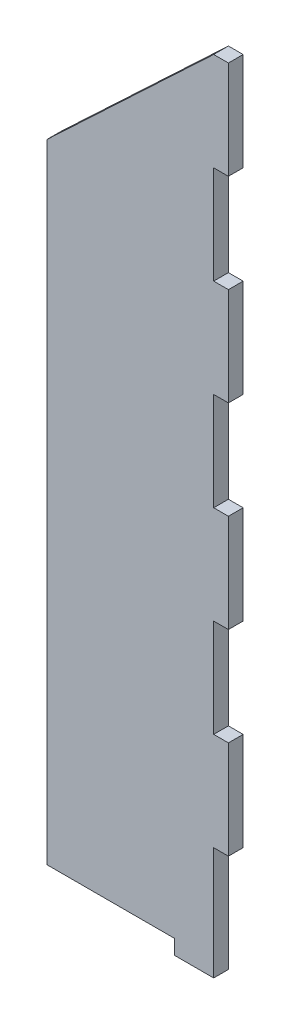
ISO-10303-21;
HEADER;
FILE_DESCRIPTION(('STEP AP214'),'2;1');
FILE_NAME('part.step','',(''),(''),'','','');
FILE_SCHEMA(('AUTOMOTIVE_DESIGN { 1 0 10303 214 1 1 1 1 }'));
ENDSEC;
DATA;
#1=APPLICATION_CONTEXT('core data for automotive mechanical design processes');
#2=APPLICATION_PROTOCOL_DEFINITION('international standard','automotive_design',2000,#1);
#3=PRODUCT_CONTEXT('',#1,'mechanical');
#4=PRODUCT('Part','Part','',(#3));
#5=PRODUCT_RELATED_PRODUCT_CATEGORY('part','',(#4));
#6=PRODUCT_DEFINITION_FORMATION('','',#4);
#7=PRODUCT_DEFINITION_CONTEXT('part definition',#1,'design');
#8=PRODUCT_DEFINITION('design','',#6,#7);
#9=PRODUCT_DEFINITION_SHAPE('','',#8);
#10=(LENGTH_UNIT() NAMED_UNIT(*) SI_UNIT(.MILLI.,.METRE.));
#11=(NAMED_UNIT(*) PLANE_ANGLE_UNIT() SI_UNIT($,.RADIAN.));
#12=(NAMED_UNIT(*) SI_UNIT($,.STERADIAN.) SOLID_ANGLE_UNIT());
#13=UNCERTAINTY_MEASURE_WITH_UNIT(LENGTH_MEASURE(1.E-05),#10,'distance_accuracy_value','');
#14=(GEOMETRIC_REPRESENTATION_CONTEXT(3) GLOBAL_UNCERTAINTY_ASSIGNED_CONTEXT((#13)) GLOBAL_UNIT_ASSIGNED_CONTEXT((#10,
#11,#12)) REPRESENTATION_CONTEXT('',''));
#15=CARTESIAN_POINT('',(0.,0.,0.));
#16=DIRECTION('',(0.,0.,1.));
#17=DIRECTION('',(1.,0.,0.));
#18=AXIS2_PLACEMENT_3D('',#15,#16,#17);
#19=CARTESIAN_POINT('',(0.,25.3999999999999,4.7625));
#20=DIRECTION('',(0.,1.,0.));
#21=DIRECTION('',(-1.,0.,0.));
#22=AXIS2_PLACEMENT_3D('',#19,#20,#21);
#23=PLANE('',#22);
#24=DIRECTION('',(1.,0.,0.));
#25=VECTOR('',#24,1.);
#26=CARTESIAN_POINT('',(0.,25.3999999999999,0.));
#27=LINE('',#26,#25);
#28=CARTESIAN_POINT('',(26.9875,25.4,0.));
#29=VERTEX_POINT('',#28);
#30=CARTESIAN_POINT('',(31.750000000001,25.4,0.));
#31=VERTEX_POINT('',#30);
#32=EDGE_CURVE('E309',#29,#31,#27,.T.);
#33=ORIENTED_EDGE('',*,*,#32,.F.);
#34=DIRECTION('',(0.,0.,-1.));
#35=VECTOR('',#34,1.);
#36=CARTESIAN_POINT('',(26.9875,25.4,4.7625));
#37=LINE('',#36,#35);
#38=CARTESIAN_POINT('',(26.9875,25.4,4.7625));
#39=VERTEX_POINT('',#38);
#40=EDGE_CURVE('E11',#39,#29,#37,.T.);
#41=ORIENTED_EDGE('',*,*,#40,.F.);
#42=DIRECTION('',(1.,0.,0.));
#43=VECTOR('',#42,1.);
#44=CARTESIAN_POINT('',(0.,25.3999999999999,4.7625));
#45=LINE('',#44,#43);
#46=CARTESIAN_POINT('',(31.750000000001,25.4,4.7625));
#47=VERTEX_POINT('',#46);
#48=EDGE_CURVE('E248',#39,#47,#45,.T.);
#49=ORIENTED_EDGE('',*,*,#48,.T.);
#50=DIRECTION('',(0.,0.,-1.));
#51=VECTOR('',#50,1.);
#52=CARTESIAN_POINT('',(31.750000000001,25.4,4.7625));
#53=LINE('',#52,#51);
#54=EDGE_CURVE('E52',#47,#31,#53,.T.);
#55=ORIENTED_EDGE('',*,*,#54,.T.);
#56=EDGE_LOOP('',(#33,#41,#49,#55));
#57=FACE_BOUND('',#56,.T.);
#58=ADVANCED_FACE('F36',(#57),#23,.T.);
#59=CARTESIAN_POINT('',(26.9875,0.,4.7625));
#60=DIRECTION('',(1.,0.,0.));
#61=DIRECTION('',(0.,1.,0.));
#62=AXIS2_PLACEMENT_3D('',#59,#60,#61);
#63=PLANE('',#62);
#64=DIRECTION('',(0.,-1.,0.));
#65=VECTOR('',#64,1.);
#66=CARTESIAN_POINT('',(26.9875,0.,0.));
#67=LINE('',#66,#65);
#68=CARTESIAN_POINT('',(26.9875,57.15,0.));
#69=VERTEX_POINT('',#68);
#70=EDGE_CURVE('E303',#69,#29,#67,.T.);
#71=ORIENTED_EDGE('',*,*,#70,.F.);
#72=DIRECTION('',(0.,0.,-1.));
#73=VECTOR('',#72,1.);
#74=CARTESIAN_POINT('',(26.9875,57.15,4.7625));
#75=LINE('',#74,#73);
#76=CARTESIAN_POINT('',(26.9875,57.15,4.7625));
#77=VERTEX_POINT('',#76);
#78=EDGE_CURVE('E44',#77,#69,#75,.T.);
#79=ORIENTED_EDGE('',*,*,#78,.F.);
#80=DIRECTION('',(0.,-1.,0.));
#81=VECTOR('',#80,1.);
#82=CARTESIAN_POINT('',(26.9875,0.,4.7625));
#83=LINE('',#82,#81);
#84=EDGE_CURVE('E245',#77,#39,#83,.T.);
#85=ORIENTED_EDGE('',*,*,#84,.T.);
#86=ORIENTED_EDGE('',*,*,#40,.T.);
#87=EDGE_LOOP('',(#71,#79,#85,#86));
#88=FACE_BOUND('',#87,.T.);
#89=ADVANCED_FACE('F308',(#88),#63,.T.);
#90=CARTESIAN_POINT('',(1.66533453693776E-13,57.1500000000001,4.7625));
#91=DIRECTION('',(0.,1.,0.));
#92=DIRECTION('',(-1.,0.,0.));
#93=AXIS2_PLACEMENT_3D('',#90,#91,#92);
#94=PLANE('',#93);
#95=DIRECTION('',(1.,0.,0.));
#96=VECTOR('',#95,1.);
#97=CARTESIAN_POINT('',(1.66533453693776E-13,57.1500000000001,0.));
#98=LINE('',#97,#96);
#99=CARTESIAN_POINT('',(31.7500000000007,57.15,0.));
#100=VERTEX_POINT('',#99);
#101=EDGE_CURVE('E296',#69,#100,#98,.T.);
#102=ORIENTED_EDGE('',*,*,#101,.T.);
#103=DIRECTION('',(0.,0.,-1.));
#104=VECTOR('',#103,1.);
#105=CARTESIAN_POINT('',(31.7500000000007,57.15,4.7625));
#106=LINE('',#105,#104);
#107=CARTESIAN_POINT('',(31.7500000000007,57.15,4.7625));
#108=VERTEX_POINT('',#107);
#109=EDGE_CURVE('E289',#108,#100,#106,.T.);
#110=ORIENTED_EDGE('',*,*,#109,.F.);
#111=DIRECTION('',(1.,0.,0.));
#112=VECTOR('',#111,1.);
#113=CARTESIAN_POINT('',(1.66533453693776E-13,57.1500000000001,4.7625));
#114=LINE('',#113,#112);
#115=EDGE_CURVE('E243',#77,#108,#114,.T.);
#116=ORIENTED_EDGE('',*,*,#115,.F.);
#117=ORIENTED_EDGE('',*,*,#78,.T.);
#118=EDGE_LOOP('',(#102,#110,#116,#117));
#119=FACE_BOUND('',#118,.T.);
#120=ADVANCED_FACE('F294',(#119),#94,.F.);
#121=CARTESIAN_POINT('',(31.7500000000006,0.,4.7625));
#122=DIRECTION('',(1.,0.,0.));
#123=DIRECTION('',(0.,1.,0.));
#124=AXIS2_PLACEMENT_3D('',#121,#122,#123);
#125=PLANE('',#124);
#126=DIRECTION('',(0.,-1.,0.));
#127=VECTOR('',#126,1.);
#128=CARTESIAN_POINT('',(31.7500000000006,0.,0.));
#129=LINE('',#128,#127);
#130=CARTESIAN_POINT('',(31.7500000000003,88.8999999999999,0.));
#131=VERTEX_POINT('',#130);
#132=EDGE_CURVE('E306',#131,#100,#129,.T.);
#133=ORIENTED_EDGE('',*,*,#132,.F.);
#134=DIRECTION('',(0.,0.,-1.));
#135=VECTOR('',#134,1.);
#136=CARTESIAN_POINT('',(31.7500000000003,88.8999999999999,4.7625));
#137=LINE('',#136,#135);
#138=CARTESIAN_POINT('',(31.7500000000003,88.8999999999999,4.7625));
#139=VERTEX_POINT('',#138);
#140=EDGE_CURVE('E287',#139,#131,#137,.T.);
#141=ORIENTED_EDGE('',*,*,#140,.F.);
#142=DIRECTION('',(0.,-1.,0.));
#143=VECTOR('',#142,1.);
#144=CARTESIAN_POINT('',(31.7500000000006,0.,4.7625));
#145=LINE('',#144,#143);
#146=EDGE_CURVE('E240',#139,#108,#145,.T.);
#147=ORIENTED_EDGE('',*,*,#146,.T.);
#148=ORIENTED_EDGE('',*,*,#109,.T.);
#149=EDGE_LOOP('',(#133,#141,#147,#148));
#150=FACE_BOUND('',#149,.T.);
#151=ADVANCED_FACE('F407',(#150),#125,.T.);
#152=CARTESIAN_POINT('',(7.77156117237622E-13,88.9000000000002,4.7625));
#153=DIRECTION('',(0.,1.,0.));
#154=DIRECTION('',(-1.,0.,0.));
#155=AXIS2_PLACEMENT_3D('',#152,#153,#154);
#156=PLANE('',#155);
#157=DIRECTION('',(1.,0.,0.));
#158=VECTOR('',#157,1.);
#159=CARTESIAN_POINT('',(7.77156117237622E-13,88.9000000000002,0.));
#160=LINE('',#159,#158);
#161=CARTESIAN_POINT('',(26.9875,88.9,0.));
#162=VERTEX_POINT('',#161);
#163=EDGE_CURVE('E315',#162,#131,#160,.T.);
#164=ORIENTED_EDGE('',*,*,#163,.F.);
#165=DIRECTION('',(0.,0.,-1.));
#166=VECTOR('',#165,1.);
#167=CARTESIAN_POINT('',(26.9875,88.9,4.7625));
#168=LINE('',#167,#166);
#169=CARTESIAN_POINT('',(26.9875,88.9,4.7625));
#170=VERTEX_POINT('',#169);
#171=EDGE_CURVE('E285',#170,#162,#168,.T.);
#172=ORIENTED_EDGE('',*,*,#171,.F.);
#173=DIRECTION('',(1.,0.,0.));
#174=VECTOR('',#173,1.);
#175=CARTESIAN_POINT('',(7.77156117237622E-13,88.9000000000002,4.7625));
#176=LINE('',#175,#174);
#177=EDGE_CURVE('E237',#170,#139,#176,.T.);
#178=ORIENTED_EDGE('',*,*,#177,.T.);
#179=ORIENTED_EDGE('',*,*,#140,.T.);
#180=EDGE_LOOP('',(#164,#172,#178,#179));
#181=FACE_BOUND('',#180,.T.);
#182=ADVANCED_FACE('F404',(#181),#156,.T.);
#183=CARTESIAN_POINT('',(26.9875,120.65,0.));
#184=VERTEX_POINT('',#183);
#185=EDGE_CURVE('E311',#184,#162,#67,.T.);
#186=ORIENTED_EDGE('',*,*,#185,.F.);
#187=DIRECTION('',(0.,0.,-1.));
#188=VECTOR('',#187,1.);
#189=CARTESIAN_POINT('',(26.9875,120.65,4.7625));
#190=LINE('',#189,#188);
#191=CARTESIAN_POINT('',(26.9875,120.65,4.7625));
#192=VERTEX_POINT('',#191);
#193=EDGE_CURVE('E283',#192,#184,#190,.T.);
#194=ORIENTED_EDGE('',*,*,#193,.F.);
#195=EDGE_CURVE('E236',#192,#170,#83,.T.);
#196=ORIENTED_EDGE('',*,*,#195,.T.);
#197=ORIENTED_EDGE('',*,*,#171,.T.);
#198=EDGE_LOOP('',(#186,#194,#196,#197));
#199=FACE_BOUND('',#198,.T.);
#200=ADVANCED_FACE('F398',(#199),#63,.T.);
#201=CARTESIAN_POINT('',(-3.51570624464675E-13,120.65,4.7625));
#202=DIRECTION('',(0.,1.,0.));
#203=DIRECTION('',(-1.,0.,0.));
#204=AXIS2_PLACEMENT_3D('',#201,#202,#203);
#205=PLANE('',#204);
#206=DIRECTION('',(1.,0.,0.));
#207=VECTOR('',#206,1.);
#208=CARTESIAN_POINT('',(-3.51570624464675E-13,120.65,0.));
#209=LINE('',#208,#207);
#210=CARTESIAN_POINT('',(31.75,120.65,0.));
#211=VERTEX_POINT('',#210);
#212=EDGE_CURVE('E314',#184,#211,#209,.T.);
#213=ORIENTED_EDGE('',*,*,#212,.T.);
#214=DIRECTION('',(0.,0.,-1.));
#215=VECTOR('',#214,1.);
#216=CARTESIAN_POINT('',(31.75,120.65,4.7625));
#217=LINE('',#216,#215);
#218=CARTESIAN_POINT('',(31.75,120.65,4.7625));
#219=VERTEX_POINT('',#218);
#220=EDGE_CURVE('E281',#219,#211,#217,.T.);
#221=ORIENTED_EDGE('',*,*,#220,.F.);
#222=DIRECTION('',(1.,0.,0.));
#223=VECTOR('',#222,1.);
#224=CARTESIAN_POINT('',(-3.51570624464675E-13,120.65,4.7625));
#225=LINE('',#224,#223);
#226=EDGE_CURVE('E234',#192,#219,#225,.T.);
#227=ORIENTED_EDGE('',*,*,#226,.F.);
#228=ORIENTED_EDGE('',*,*,#193,.T.);
#229=EDGE_LOOP('',(#213,#221,#227,#228));
#230=FACE_BOUND('',#229,.T.);
#231=ADVANCED_FACE('F431',(#230),#205,.F.);
#232=CARTESIAN_POINT('',(31.75,0.,4.7625));
#233=DIRECTION('',(1.,0.,0.));
#234=DIRECTION('',(0.,1.,0.));
#235=AXIS2_PLACEMENT_3D('',#232,#233,#234);
#236=PLANE('',#235);
#237=DIRECTION('',(0.,-1.,0.));
#238=VECTOR('',#237,1.);
#239=CARTESIAN_POINT('',(31.75,0.,0.));
#240=LINE('',#239,#238);
#241=CARTESIAN_POINT('',(31.75,152.4,0.));
#242=VERTEX_POINT('',#241);
#243=EDGE_CURVE('E319',#242,#211,#240,.T.);
#244=ORIENTED_EDGE('',*,*,#243,.F.);
#245=DIRECTION('',(0.,0.,-1.));
#246=VECTOR('',#245,1.);
#247=CARTESIAN_POINT('',(31.75,152.4,4.7625));
#248=LINE('',#247,#246);
#249=CARTESIAN_POINT('',(31.75,152.4,4.7625));
#250=VERTEX_POINT('',#249);
#251=EDGE_CURVE('E279',#250,#242,#248,.T.);
#252=ORIENTED_EDGE('',*,*,#251,.F.);
#253=DIRECTION('',(0.,-1.,0.));
#254=VECTOR('',#253,1.);
#255=CARTESIAN_POINT('',(31.75,0.,4.7625));
#256=LINE('',#255,#254);
#257=EDGE_CURVE('E231',#250,#219,#256,.T.);
#258=ORIENTED_EDGE('',*,*,#257,.T.);
#259=ORIENTED_EDGE('',*,*,#220,.T.);
#260=EDGE_LOOP('',(#244,#252,#258,#259));
#261=FACE_BOUND('',#260,.T.);
#262=ADVANCED_FACE('F394',(#261),#236,.T.);
#263=CARTESIAN_POINT('',(0.,152.4,4.7625));
#264=DIRECTION('',(0.,1.,0.));
#265=DIRECTION('',(0.,0.,1.));
#266=AXIS2_PLACEMENT_3D('',#263,#264,#265);
#267=PLANE('',#266);
#268=DIRECTION('',(1.,0.,0.));
#269=VECTOR('',#268,1.);
#270=CARTESIAN_POINT('',(0.,152.4,0.));
#271=LINE('',#270,#269);
#272=CARTESIAN_POINT('',(26.9875,152.4,0.));
#273=VERTEX_POINT('',#272);
#274=EDGE_CURVE('E327',#273,#242,#271,.T.);
#275=ORIENTED_EDGE('',*,*,#274,.F.);
#276=DIRECTION('',(0.,0.,-1.));
#277=VECTOR('',#276,1.);
#278=CARTESIAN_POINT('',(26.9875,152.4,4.7625));
#279=LINE('',#278,#277);
#280=CARTESIAN_POINT('',(26.9875,152.4,4.7625));
#281=VERTEX_POINT('',#280);
#282=EDGE_CURVE('E277',#281,#273,#279,.T.);
#283=ORIENTED_EDGE('',*,*,#282,.F.);
#284=DIRECTION('',(1.,0.,0.));
#285=VECTOR('',#284,1.);
#286=CARTESIAN_POINT('',(0.,152.4,4.7625));
#287=LINE('',#286,#285);
#288=EDGE_CURVE('E228',#281,#250,#287,.T.);
#289=ORIENTED_EDGE('',*,*,#288,.T.);
#290=ORIENTED_EDGE('',*,*,#251,.T.);
#291=EDGE_LOOP('',(#275,#283,#289,#290));
#292=FACE_BOUND('',#291,.T.);
#293=ADVANCED_FACE('F390',(#292),#267,.T.);
#294=CARTESIAN_POINT('',(-63.3834862385321,67.3449541284404,4.7625));
#295=DIRECTION('',(-0.685364699004991,0.728199992692803,0.));
#296=DIRECTION('',(-0.728199992692803,-0.685364699004991,0.));
#297=AXIS2_PLACEMENT_3D('',#294,#295,#296);
#298=PLANE('',#297);
#299=DIRECTION('',(0.728199992692803,0.685364699004991,0.));
#300=VECTOR('',#299,1.);
#301=CARTESIAN_POINT('',(-63.3834862385321,67.3449541284404,0.));
#302=LINE('',#301,#300);
#303=CARTESIAN_POINT('',(-26.9875,101.6,0.));
#304=VERTEX_POINT('',#303);
#305=EDGE_CURVE('E330',#304,#273,#302,.T.);
#306=ORIENTED_EDGE('',*,*,#305,.F.);
#307=DIRECTION('',(0.,0.,-1.));
#308=VECTOR('',#307,1.);
#309=CARTESIAN_POINT('',(-26.9875,101.6,4.7625));
#310=LINE('',#309,#308);
#311=CARTESIAN_POINT('',(-26.9875,101.6,4.7625));
#312=VERTEX_POINT('',#311);
#313=EDGE_CURVE('E275',#312,#304,#310,.T.);
#314=ORIENTED_EDGE('',*,*,#313,.F.);
#315=DIRECTION('',(0.728199992692803,0.685364699004991,0.));
#316=VECTOR('',#315,1.);
#317=CARTESIAN_POINT('',(-63.3834862385321,67.3449541284404,4.7625));
#318=LINE('',#317,#316);
#319=EDGE_CURVE('E225',#312,#281,#318,.T.);
#320=ORIENTED_EDGE('',*,*,#319,.T.);
#321=ORIENTED_EDGE('',*,*,#282,.T.);
#322=EDGE_LOOP('',(#306,#314,#320,#321));
#323=FACE_BOUND('',#322,.T.);
#324=ADVANCED_FACE('F386',(#323),#298,.T.);
#325=CARTESIAN_POINT('',(-26.9875,0.,4.7625));
#326=DIRECTION('',(-1.,0.,0.));
#327=DIRECTION('',(0.,-1.,0.));
#328=AXIS2_PLACEMENT_3D('',#325,#326,#327);
#329=PLANE('',#328);
#330=DIRECTION('',(0.,1.,0.));
#331=VECTOR('',#330,1.);
#332=CARTESIAN_POINT('',(-26.9875,0.,0.));
#333=LINE('',#332,#331);
#334=CARTESIAN_POINT('',(-26.9875,-101.6,0.));
#335=VERTEX_POINT('',#334);
#336=EDGE_CURVE('E333',#335,#304,#333,.T.);
#337=ORIENTED_EDGE('',*,*,#336,.F.);
#338=DIRECTION('',(0.,0.,-1.));
#339=VECTOR('',#338,1.);
#340=CARTESIAN_POINT('',(-26.9875,-101.6,4.7625));
#341=LINE('',#340,#339);
#342=CARTESIAN_POINT('',(-26.9875,-101.6,4.7625));
#343=VERTEX_POINT('',#342);
#344=EDGE_CURVE('E273',#343,#335,#341,.T.);
#345=ORIENTED_EDGE('',*,*,#344,.F.);
#346=DIRECTION('',(0.,1.,0.));
#347=VECTOR('',#346,1.);
#348=CARTESIAN_POINT('',(-26.9875,0.,4.7625));
#349=LINE('',#348,#347);
#350=EDGE_CURVE('E222',#343,#312,#349,.T.);
#351=ORIENTED_EDGE('',*,*,#350,.T.);
#352=ORIENTED_EDGE('',*,*,#313,.T.);
#353=EDGE_LOOP('',(#337,#345,#351,#352));
#354=FACE_BOUND('',#353,.T.);
#355=ADVANCED_FACE('F382',(#354),#329,.T.);
#356=CARTESIAN_POINT('',(1.30614473485313E-13,-101.6,4.7625));
#357=DIRECTION('',(0.,-1.,0.));
#358=DIRECTION('',(1.,0.,0.));
#359=AXIS2_PLACEMENT_3D('',#356,#357,#358);
#360=PLANE('',#359);
#361=DIRECTION('',(-1.,0.,0.));
#362=VECTOR('',#361,1.);
#363=CARTESIAN_POINT('',(1.30614473485313E-13,-101.6,0.));
#364=LINE('',#363,#362);
#365=CARTESIAN_POINT('',(14.2875,-101.6,0.));
#366=VERTEX_POINT('',#365);
#367=EDGE_CURVE('E336',#366,#335,#364,.T.);
#368=ORIENTED_EDGE('',*,*,#367,.F.);
#369=DIRECTION('',(0.,0.,-1.));
#370=VECTOR('',#369,1.);
#371=CARTESIAN_POINT('',(14.2875,-101.6,4.7625));
#372=LINE('',#371,#370);
#373=CARTESIAN_POINT('',(14.2875,-101.6,4.7625));
#374=VERTEX_POINT('',#373);
#375=EDGE_CURVE('E271',#374,#366,#372,.T.);
#376=ORIENTED_EDGE('',*,*,#375,.F.);
#377=DIRECTION('',(-1.,0.,0.));
#378=VECTOR('',#377,1.);
#379=CARTESIAN_POINT('',(1.30614473485313E-13,-101.6,4.7625));
#380=LINE('',#379,#378);
#381=EDGE_CURVE('E217',#374,#343,#380,.T.);
#382=ORIENTED_EDGE('',*,*,#381,.T.);
#383=ORIENTED_EDGE('',*,*,#344,.T.);
#384=EDGE_LOOP('',(#368,#376,#382,#383));
#385=FACE_BOUND('',#384,.T.);
#386=ADVANCED_FACE('F376',(#385),#360,.T.);
#387=CARTESIAN_POINT('',(14.2875000000002,0.,4.7625));
#388=DIRECTION('',(1.,0.,0.));
#389=DIRECTION('',(0.,1.,0.));
#390=AXIS2_PLACEMENT_3D('',#387,#388,#389);
#391=PLANE('',#390);
#392=DIRECTION('',(0.,-1.,0.));
#393=VECTOR('',#392,1.);
#394=CARTESIAN_POINT('',(14.2875000000002,0.,0.));
#395=LINE('',#394,#393);
#396=CARTESIAN_POINT('',(14.2875,-106.3625,0.));
#397=VERTEX_POINT('',#396);
#398=EDGE_CURVE('E339',#366,#397,#395,.T.);
#399=ORIENTED_EDGE('',*,*,#398,.T.);
#400=DIRECTION('',(0.,0.,-1.));
#401=VECTOR('',#400,1.);
#402=CARTESIAN_POINT('',(14.2875,-106.3625,4.7625));
#403=LINE('',#402,#401);
#404=CARTESIAN_POINT('',(14.2875,-106.3625,4.7625));
#405=VERTEX_POINT('',#404);
#406=EDGE_CURVE('E268',#405,#397,#403,.T.);
#407=ORIENTED_EDGE('',*,*,#406,.F.);
#408=DIRECTION('',(0.,-1.,0.));
#409=VECTOR('',#408,1.);
#410=CARTESIAN_POINT('',(14.2875000000002,0.,4.7625));
#411=LINE('',#410,#409);
#412=EDGE_CURVE('E214',#374,#405,#411,.T.);
#413=ORIENTED_EDGE('',*,*,#412,.F.);
#414=ORIENTED_EDGE('',*,*,#375,.T.);
#415=EDGE_LOOP('',(#399,#407,#413,#414));
#416=FACE_BOUND('',#415,.T.);
#417=ADVANCED_FACE('F549',(#416),#391,.F.);
#418=CARTESIAN_POINT('',(0.,-106.3625,4.7625));
#419=DIRECTION('',(0.,1.,0.));
#420=DIRECTION('',(0.,0.,1.));
#421=AXIS2_PLACEMENT_3D('',#418,#419,#420);
#422=PLANE('',#421);
#423=DIRECTION('',(1.,0.,0.));
#424=VECTOR('',#423,1.);
#425=CARTESIAN_POINT('',(0.,-106.3625,0.));
#426=LINE('',#425,#424);
#427=CARTESIAN_POINT('',(26.9875,-106.3625,0.));
#428=VERTEX_POINT('',#427);
#429=EDGE_CURVE('E341',#397,#428,#426,.T.);
#430=ORIENTED_EDGE('',*,*,#429,.T.);
#431=DIRECTION('',(0.,0.,-1.));
#432=VECTOR('',#431,1.);
#433=CARTESIAN_POINT('',(26.9875,-106.3625,4.7625));
#434=LINE('',#433,#432);
#435=CARTESIAN_POINT('',(26.9875,-106.3625,4.7625));
#436=VERTEX_POINT('',#435);
#437=EDGE_CURVE('E266',#436,#428,#434,.T.);
#438=ORIENTED_EDGE('',*,*,#437,.F.);
#439=DIRECTION('',(1.,0.,0.));
#440=VECTOR('',#439,1.);
#441=CARTESIAN_POINT('',(0.,-106.3625,4.7625));
#442=LINE('',#441,#440);
#443=EDGE_CURVE('E211',#405,#436,#442,.T.);
#444=ORIENTED_EDGE('',*,*,#443,.F.);
#445=ORIENTED_EDGE('',*,*,#406,.T.);
#446=EDGE_LOOP('',(#430,#438,#444,#445));
#447=FACE_BOUND('',#446,.T.);
#448=ADVANCED_FACE('F370',(#447),#422,.F.);
#449=CARTESIAN_POINT('',(26.9875,0.,4.7625));
#450=DIRECTION('',(1.,0.,0.));
#451=DIRECTION('',(0.,1.,0.));
#452=AXIS2_PLACEMENT_3D('',#449,#450,#451);
#453=PLANE('',#452);
#454=DIRECTION('',(0.,-1.,0.));
#455=VECTOR('',#454,1.);
#456=CARTESIAN_POINT('',(26.9875,0.,0.));
#457=LINE('',#456,#455);
#458=CARTESIAN_POINT('',(26.9875,-69.8500000000001,0.));
#459=VERTEX_POINT('',#458);
#460=EDGE_CURVE('E344',#459,#428,#457,.T.);
#461=ORIENTED_EDGE('',*,*,#460,.F.);
#462=DIRECTION('',(0.,0.,-1.));
#463=VECTOR('',#462,1.);
#464=CARTESIAN_POINT('',(26.9875,-69.8500000000001,4.7625));
#465=LINE('',#464,#463);
#466=CARTESIAN_POINT('',(26.9875,-69.8500000000001,4.7625));
#467=VERTEX_POINT('',#466);
#468=EDGE_CURVE('E264',#467,#459,#465,.T.);
#469=ORIENTED_EDGE('',*,*,#468,.F.);
#470=DIRECTION('',(0.,-1.,0.));
#471=VECTOR('',#470,1.);
#472=CARTESIAN_POINT('',(26.9875,0.,4.7625));
#473=LINE('',#472,#471);
#474=EDGE_CURVE('E204',#467,#436,#473,.T.);
#475=ORIENTED_EDGE('',*,*,#474,.T.);
#476=ORIENTED_EDGE('',*,*,#437,.T.);
#477=EDGE_LOOP('',(#461,#469,#475,#476));
#478=FACE_BOUND('',#477,.T.);
#479=ADVANCED_FACE('F368',(#478),#453,.T.);
#480=CARTESIAN_POINT('',(1.42478621493504E-12,-69.8500000000006,4.7625));
#481=DIRECTION('',(0.,1.,0.));
#482=DIRECTION('',(-1.,0.,0.));
#483=AXIS2_PLACEMENT_3D('',#480,#481,#482);
#484=PLANE('',#483);
#485=DIRECTION('',(1.,0.,0.));
#486=VECTOR('',#485,1.);
#487=CARTESIAN_POINT('',(1.42478621493504E-12,-69.8500000000006,0.));
#488=LINE('',#487,#486);
#489=CARTESIAN_POINT('',(31.750000000002,-69.85,0.));
#490=VERTEX_POINT('',#489);
#491=EDGE_CURVE('E347',#459,#490,#488,.T.);
#492=ORIENTED_EDGE('',*,*,#491,.T.);
#493=DIRECTION('',(0.,0.,-1.));
#494=VECTOR('',#493,1.);
#495=CARTESIAN_POINT('',(31.750000000002,-69.85,4.7625));
#496=LINE('',#495,#494);
#497=CARTESIAN_POINT('',(31.750000000002,-69.85,4.7625));
#498=VERTEX_POINT('',#497);
#499=EDGE_CURVE('E262',#498,#490,#496,.T.);
#500=ORIENTED_EDGE('',*,*,#499,.F.);
#501=DIRECTION('',(1.,0.,0.));
#502=VECTOR('',#501,1.);
#503=CARTESIAN_POINT('',(1.42478621493504E-12,-69.8500000000006,4.7625));
#504=LINE('',#503,#502);
#505=EDGE_CURVE('E210',#467,#498,#504,.T.);
#506=ORIENTED_EDGE('',*,*,#505,.F.);
#507=ORIENTED_EDGE('',*,*,#468,.T.);
#508=EDGE_LOOP('',(#492,#500,#506,#507));
#509=FACE_BOUND('',#508,.T.);
#510=ADVANCED_FACE('F365',(#509),#484,.F.);
#511=CARTESIAN_POINT('',(31.750000000002,0.,4.7625));
#512=DIRECTION('',(1.,0.,0.));
#513=DIRECTION('',(0.,1.,0.));
#514=AXIS2_PLACEMENT_3D('',#511,#512,#513);
#515=PLANE('',#514);
#516=DIRECTION('',(0.,-1.,0.));
#517=VECTOR('',#516,1.);
#518=CARTESIAN_POINT('',(31.750000000002,0.,0.));
#519=LINE('',#518,#517);
#520=CARTESIAN_POINT('',(31.7500000000017,-38.1,0.));
#521=VERTEX_POINT('',#520);
#522=EDGE_CURVE('E350',#521,#490,#519,.T.);
#523=ORIENTED_EDGE('',*,*,#522,.F.);
#524=DIRECTION('',(0.,0.,-1.));
#525=VECTOR('',#524,1.);
#526=CARTESIAN_POINT('',(31.7500000000017,-38.1,4.7625));
#527=LINE('',#526,#525);
#528=CARTESIAN_POINT('',(31.7500000000017,-38.1,4.7625));
#529=VERTEX_POINT('',#528);
#530=EDGE_CURVE('E260',#529,#521,#527,.T.);
#531=ORIENTED_EDGE('',*,*,#530,.F.);
#532=DIRECTION('',(0.,-1.,0.));
#533=VECTOR('',#532,1.);
#534=CARTESIAN_POINT('',(31.750000000002,0.,4.7625));
#535=LINE('',#534,#533);
#536=EDGE_CURVE('E205',#529,#498,#535,.T.);
#537=ORIENTED_EDGE('',*,*,#536,.T.);
#538=ORIENTED_EDGE('',*,*,#499,.T.);
#539=EDGE_LOOP('',(#523,#531,#537,#538));
#540=FACE_BOUND('',#539,.T.);
#541=ADVANCED_FACE('F361',(#540),#515,.T.);
#542=CARTESIAN_POINT('',(3.33066907387554E-13,-38.1000000000003,4.7625));
#543=DIRECTION('',(0.,1.,0.));
#544=DIRECTION('',(-1.,0.,0.));
#545=AXIS2_PLACEMENT_3D('',#542,#543,#544);
#546=PLANE('',#545);
#547=DIRECTION('',(1.,0.,0.));
#548=VECTOR('',#547,1.);
#549=CARTESIAN_POINT('',(3.33066907387554E-13,-38.1000000000003,0.));
#550=LINE('',#549,#548);
#551=CARTESIAN_POINT('',(26.9875,-38.1000000000001,0.));
#552=VERTEX_POINT('',#551);
#553=EDGE_CURVE('E352',#552,#521,#550,.T.);
#554=ORIENTED_EDGE('',*,*,#553,.F.);
#555=DIRECTION('',(0.,0.,-1.));
#556=VECTOR('',#555,1.);
#557=CARTESIAN_POINT('',(26.9875,-38.1000000000001,4.7625));
#558=LINE('',#557,#556);
#559=CARTESIAN_POINT('',(26.9875,-38.1000000000001,4.7625));
#560=VERTEX_POINT('',#559);
#561=EDGE_CURVE('E190',#560,#552,#558,.T.);
#562=ORIENTED_EDGE('',*,*,#561,.F.);
#563=DIRECTION('',(1.,0.,0.));
#564=VECTOR('',#563,1.);
#565=CARTESIAN_POINT('',(3.33066907387554E-13,-38.1000000000003,4.7625));
#566=LINE('',#565,#564);
#567=EDGE_CURVE('E202',#560,#529,#566,.T.);
#568=ORIENTED_EDGE('',*,*,#567,.T.);
#569=ORIENTED_EDGE('',*,*,#530,.T.);
#570=EDGE_LOOP('',(#554,#562,#568,#569));
#571=FACE_BOUND('',#570,.T.);
#572=ADVANCED_FACE('F358',(#571),#546,.T.);
#573=CARTESIAN_POINT('',(26.9875,-6.35000000000005,0.));
#574=VERTEX_POINT('',#573);
#575=EDGE_CURVE('E187',#574,#552,#457,.T.);
#576=ORIENTED_EDGE('',*,*,#575,.F.);
#577=DIRECTION('',(0.,0.,-1.));
#578=VECTOR('',#577,1.);
#579=CARTESIAN_POINT('',(26.9875,-6.35000000000005,4.7625));
#580=LINE('',#579,#578);
#581=CARTESIAN_POINT('',(26.9875,-6.35000000000005,4.7625));
#582=VERTEX_POINT('',#581);
#583=EDGE_CURVE('E181',#582,#574,#580,.T.);
#584=ORIENTED_EDGE('',*,*,#583,.F.);
#585=EDGE_CURVE('E185',#582,#560,#473,.T.);
#586=ORIENTED_EDGE('',*,*,#585,.T.);
#587=ORIENTED_EDGE('',*,*,#561,.T.);
#588=EDGE_LOOP('',(#576,#584,#586,#587));
#589=FACE_BOUND('',#588,.T.);
#590=ADVANCED_FACE('F183',(#589),#453,.T.);
#591=CARTESIAN_POINT('',(0.,-6.35000000000029,4.7625));
#592=DIRECTION('',(0.,1.,0.));
#593=DIRECTION('',(-1.,0.,0.));
#594=AXIS2_PLACEMENT_3D('',#591,#592,#593);
#595=PLANE('',#594);
#596=DIRECTION('',(1.,0.,0.));
#597=VECTOR('',#596,1.);
#598=CARTESIAN_POINT('',(0.,-6.35000000000029,0.));
#599=LINE('',#598,#597);
#600=CARTESIAN_POINT('',(31.7500000000013,-6.35000000000001,0.));
#601=VERTEX_POINT('',#600);
#602=EDGE_CURVE('E251',#574,#601,#599,.T.);
#603=ORIENTED_EDGE('',*,*,#602,.T.);
#604=DIRECTION('',(0.,0.,-1.));
#605=VECTOR('',#604,1.);
#606=CARTESIAN_POINT('',(31.7500000000013,-6.35000000000001,4.7625));
#607=LINE('',#606,#605);
#608=CARTESIAN_POINT('',(31.7500000000013,-6.35000000000001,4.7625));
#609=VERTEX_POINT('',#608);
#610=EDGE_CURVE('E117',#609,#601,#607,.T.);
#611=ORIENTED_EDGE('',*,*,#610,.F.);
#612=DIRECTION('',(1.,0.,0.));
#613=VECTOR('',#612,1.);
#614=CARTESIAN_POINT('',(0.,-6.35000000000029,4.7625));
#615=LINE('',#614,#613);
#616=EDGE_CURVE('E192',#582,#609,#615,.T.);
#617=ORIENTED_EDGE('',*,*,#616,.F.);
#618=ORIENTED_EDGE('',*,*,#583,.T.);
#619=EDGE_LOOP('',(#603,#611,#617,#618));
#620=FACE_BOUND('',#619,.T.);
#621=ADVANCED_FACE('F193',(#620),#595,.F.);
#622=CARTESIAN_POINT('',(31.7500000000013,0.,4.7625));
#623=DIRECTION('',(1.,0.,0.));
#624=DIRECTION('',(0.,1.,0.));
#625=AXIS2_PLACEMENT_3D('',#622,#623,#624);
#626=PLANE('',#625);
#627=DIRECTION('',(0.,-1.,0.));
#628=VECTOR('',#627,1.);
#629=CARTESIAN_POINT('',(31.7500000000013,0.,0.));
#630=LINE('',#629,#628);
#631=EDGE_CURVE('E249',#31,#601,#630,.T.);
#632=ORIENTED_EDGE('',*,*,#631,.F.);
#633=ORIENTED_EDGE('',*,*,#54,.F.);
#634=DIRECTION('',(0.,-1.,0.));
#635=VECTOR('',#634,1.);
#636=CARTESIAN_POINT('',(31.7500000000013,0.,4.7625));
#637=LINE('',#636,#635);
#638=EDGE_CURVE('E196',#47,#609,#637,.T.);
#639=ORIENTED_EDGE('',*,*,#638,.T.);
#640=ORIENTED_EDGE('',*,*,#610,.T.);
#641=EDGE_LOOP('',(#632,#633,#639,#640));
#642=FACE_BOUND('',#641,.T.);
#643=ADVANCED_FACE('F410',(#642),#626,.T.);
#644=CARTESIAN_POINT('',(0.,0.,4.7625));
#645=DIRECTION('',(0.,0.,1.));
#646=DIRECTION('',(1.,0.,0.));
#647=AXIS2_PLACEMENT_3D('',#644,#645,#646);
#648=PLANE('',#647);
#649=ORIENTED_EDGE('',*,*,#48,.F.);
#650=ORIENTED_EDGE('',*,*,#84,.F.);
#651=ORIENTED_EDGE('',*,*,#115,.T.);
#652=ORIENTED_EDGE('',*,*,#146,.F.);
#653=ORIENTED_EDGE('',*,*,#177,.F.);
#654=ORIENTED_EDGE('',*,*,#195,.F.);
#655=ORIENTED_EDGE('',*,*,#226,.T.);
#656=ORIENTED_EDGE('',*,*,#257,.F.);
#657=ORIENTED_EDGE('',*,*,#288,.F.);
#658=ORIENTED_EDGE('',*,*,#319,.F.);
#659=ORIENTED_EDGE('',*,*,#350,.F.);
#660=ORIENTED_EDGE('',*,*,#381,.F.);
#661=ORIENTED_EDGE('',*,*,#412,.T.);
#662=ORIENTED_EDGE('',*,*,#443,.T.);
#663=ORIENTED_EDGE('',*,*,#474,.F.);
#664=ORIENTED_EDGE('',*,*,#505,.T.);
#665=ORIENTED_EDGE('',*,*,#536,.F.);
#666=ORIENTED_EDGE('',*,*,#567,.F.);
#667=ORIENTED_EDGE('',*,*,#585,.F.);
#668=ORIENTED_EDGE('',*,*,#616,.T.);
#669=ORIENTED_EDGE('',*,*,#638,.F.);
#670=EDGE_LOOP('',(#649,#650,#651,#652,#653,#654,#655,#656,#657,#658,#659,#660,#661,#662,#663,
#664,#665,#666,#667,#668,#669));
#671=FACE_BOUND('',#670,.T.);
#672=ADVANCED_FACE('F199',(#671),#648,.T.);
#673=CARTESIAN_POINT('',(0.,0.,0.));
#674=DIRECTION('',(0.,0.,1.));
#675=DIRECTION('',(1.,0.,0.));
#676=AXIS2_PLACEMENT_3D('',#673,#674,#675);
#677=PLANE('',#676);
#678=ORIENTED_EDGE('',*,*,#32,.T.);
#679=ORIENTED_EDGE('',*,*,#631,.T.);
#680=ORIENTED_EDGE('',*,*,#602,.F.);
#681=ORIENTED_EDGE('',*,*,#575,.T.);
#682=ORIENTED_EDGE('',*,*,#553,.T.);
#683=ORIENTED_EDGE('',*,*,#522,.T.);
#684=ORIENTED_EDGE('',*,*,#491,.F.);
#685=ORIENTED_EDGE('',*,*,#460,.T.);
#686=ORIENTED_EDGE('',*,*,#429,.F.);
#687=ORIENTED_EDGE('',*,*,#398,.F.);
#688=ORIENTED_EDGE('',*,*,#367,.T.);
#689=ORIENTED_EDGE('',*,*,#336,.T.);
#690=ORIENTED_EDGE('',*,*,#305,.T.);
#691=ORIENTED_EDGE('',*,*,#274,.T.);
#692=ORIENTED_EDGE('',*,*,#243,.T.);
#693=ORIENTED_EDGE('',*,*,#212,.F.);
#694=ORIENTED_EDGE('',*,*,#185,.T.);
#695=ORIENTED_EDGE('',*,*,#163,.T.);
#696=ORIENTED_EDGE('',*,*,#132,.T.);
#697=ORIENTED_EDGE('',*,*,#101,.F.);
#698=ORIENTED_EDGE('',*,*,#70,.T.);
#699=EDGE_LOOP('',(#678,#679,#680,#681,#682,#683,#684,#685,#686,#687,#688,#689,#690,#691,#692,
#693,#694,#695,#696,#697,#698));
#700=FACE_BOUND('',#699,.T.);
#701=ADVANCED_FACE('F302',(#700),#677,.F.);
#702=CLOSED_SHELL('',(#58,#89,#120,#151,#182,#200,#231,#262,#293,#324,#355,#386,#417,#448,#479,
#510,#541,#572,#590,#621,#643,#672,#701));
#703=MANIFOLD_SOLID_BREP('B2',#702);
#704=ADVANCED_BREP_SHAPE_REPRESENTATION('',(#18,#703),#14);
#705=SHAPE_DEFINITION_REPRESENTATION(#9,#704);
ENDSEC;
END-ISO-10303-21;
